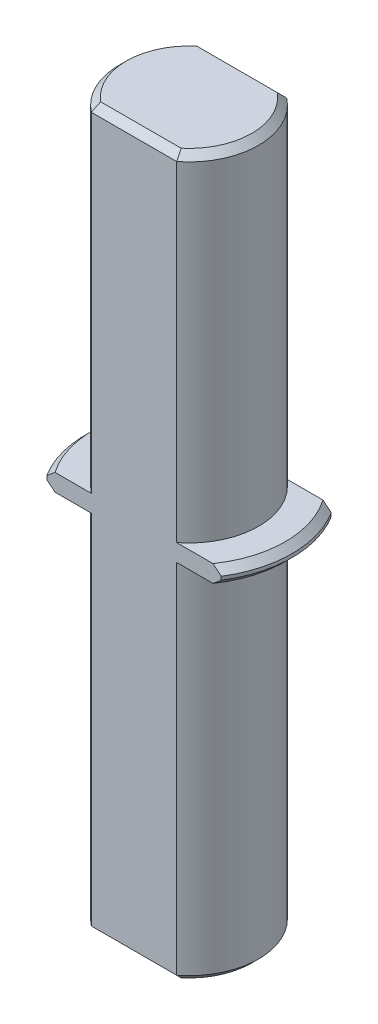
ISO-10303-21;
HEADER;
FILE_DESCRIPTION(('STEP AP214'),'2;1');
FILE_NAME('part.step','',(''),(''),'','','');
FILE_SCHEMA(('AUTOMOTIVE_DESIGN { 1 0 10303 214 1 1 1 1 }'));
ENDSEC;
DATA;
#1=APPLICATION_CONTEXT('core data for automotive mechanical design processes');
#2=APPLICATION_PROTOCOL_DEFINITION('international standard','automotive_design',2000,#1);
#3=PRODUCT_CONTEXT('',#1,'mechanical');
#4=PRODUCT('Part','Part','',(#3));
#5=PRODUCT_RELATED_PRODUCT_CATEGORY('part','',(#4));
#6=PRODUCT_DEFINITION_FORMATION('','',#4);
#7=PRODUCT_DEFINITION_CONTEXT('part definition',#1,'design');
#8=PRODUCT_DEFINITION('design','',#6,#7);
#9=PRODUCT_DEFINITION_SHAPE('','',#8);
#10=(LENGTH_UNIT() NAMED_UNIT(*) SI_UNIT(.MILLI.,.METRE.));
#11=(NAMED_UNIT(*) PLANE_ANGLE_UNIT() SI_UNIT($,.RADIAN.));
#12=(NAMED_UNIT(*) SI_UNIT($,.STERADIAN.) SOLID_ANGLE_UNIT());
#13=UNCERTAINTY_MEASURE_WITH_UNIT(LENGTH_MEASURE(1.E-05),#10,'distance_accuracy_value','');
#14=(GEOMETRIC_REPRESENTATION_CONTEXT(3) GLOBAL_UNCERTAINTY_ASSIGNED_CONTEXT((#13)) GLOBAL_UNIT_ASSIGNED_CONTEXT((#10,
#11,#12)) REPRESENTATION_CONTEXT('',''));
#15=CARTESIAN_POINT('',(0.,0.,0.));
#16=DIRECTION('',(0.,0.,1.));
#17=DIRECTION('',(1.,0.,0.));
#18=AXIS2_PLACEMENT_3D('',#15,#16,#17);
#19=CARTESIAN_POINT('',(0.,41.8,0.));
#20=DIRECTION('',(0.,-1.,0.));
#21=DIRECTION('',(0.,0.,-1.));
#22=AXIS2_PLACEMENT_3D('',#19,#20,#21);
#23=CYLINDRICAL_SURFACE('',#22,4.05);
#24=CARTESIAN_POINT('',(0.,21.2,0.));
#25=DIRECTION('',(0.,1.,0.));
#26=DIRECTION('',(0.,0.,1.));
#27=AXIS2_PLACEMENT_3D('',#24,#25,#26);
#28=CIRCLE('',#27,4.05);
#29=CARTESIAN_POINT('',(-2.48243831746128,21.2,-3.2));
#30=VERTEX_POINT('',#29);
#31=CARTESIAN_POINT('',(-2.48243831746128,21.2,3.2));
#32=VERTEX_POINT('',#31);
#33=EDGE_CURVE('E347',#30,#32,#28,.T.);
#34=ORIENTED_EDGE('',*,*,#33,.F.);
#35=DIRECTION('',(0.,-1.,0.));
#36=VECTOR('',#35,1.);
#37=CARTESIAN_POINT('',(-2.48243831746128,41.8,-3.2));
#38=LINE('',#37,#36);
#39=CARTESIAN_POINT('',(-2.48243831746128,0.400000000000005,-3.2));
#40=VERTEX_POINT('',#39);
#41=EDGE_CURVE('E533',#30,#40,#38,.T.);
#42=ORIENTED_EDGE('',*,*,#41,.T.);
#43=CARTESIAN_POINT('',(0.,0.400000000000005,0.));
#44=DIRECTION('',(0.,1.,0.));
#45=DIRECTION('',(0.,0.,1.));
#46=AXIS2_PLACEMENT_3D('',#43,#44,#45);
#47=CIRCLE('',#46,4.05);
#48=CARTESIAN_POINT('',(-2.48243831746128,0.400000000000005,3.2));
#49=VERTEX_POINT('',#48);
#50=EDGE_CURVE('E247',#40,#49,#47,.T.);
#51=ORIENTED_EDGE('',*,*,#50,.T.);
#52=DIRECTION('',(0.,-1.,0.));
#53=VECTOR('',#52,1.);
#54=CARTESIAN_POINT('',(-2.48243831746128,41.8,3.2));
#55=LINE('',#54,#53);
#56=EDGE_CURVE('E235',#32,#49,#55,.T.);
#57=ORIENTED_EDGE('',*,*,#56,.F.);
#58=EDGE_LOOP('',(#34,#42,#51,#57));
#59=FACE_BOUND('',#58,.T.);
#60=ADVANCED_FACE('F67',(#59),#23,.T.);
#61=CARTESIAN_POINT('',(0.,41.8,0.));
#62=DIRECTION('',(0.,-1.,0.));
#63=DIRECTION('',(0.,0.,-1.));
#64=AXIS2_PLACEMENT_3D('',#61,#62,#63);
#65=CYLINDRICAL_SURFACE('',#64,4.05);
#66=CARTESIAN_POINT('',(0.,21.2,0.));
#67=DIRECTION('',(0.,1.,0.));
#68=DIRECTION('',(0.,0.,1.));
#69=AXIS2_PLACEMENT_3D('',#66,#67,#68);
#70=CIRCLE('',#69,4.05);
#71=CARTESIAN_POINT('',(2.48243831746128,21.2,3.2));
#72=VERTEX_POINT('',#71);
#73=CARTESIAN_POINT('',(2.48243831746128,21.2,-3.2));
#74=VERTEX_POINT('',#73);
#75=EDGE_CURVE('E218',#72,#74,#70,.T.);
#76=ORIENTED_EDGE('',*,*,#75,.F.);
#77=DIRECTION('',(0.,-1.,0.));
#78=VECTOR('',#77,1.);
#79=CARTESIAN_POINT('',(2.48243831746128,41.8,3.2));
#80=LINE('',#79,#78);
#81=CARTESIAN_POINT('',(2.48243831746128,0.400000000000005,3.2));
#82=VERTEX_POINT('',#81);
#83=EDGE_CURVE('E236',#72,#82,#80,.T.);
#84=ORIENTED_EDGE('',*,*,#83,.T.);
#85=CARTESIAN_POINT('',(0.,0.400000000000005,0.));
#86=DIRECTION('',(0.,1.,0.));
#87=DIRECTION('',(0.,0.,1.));
#88=AXIS2_PLACEMENT_3D('',#85,#86,#87);
#89=CIRCLE('',#88,4.05);
#90=CARTESIAN_POINT('',(2.48243831746128,0.400000000000005,-3.2));
#91=VERTEX_POINT('',#90);
#92=EDGE_CURVE('E266',#82,#91,#89,.T.);
#93=ORIENTED_EDGE('',*,*,#92,.T.);
#94=DIRECTION('',(0.,-1.,0.));
#95=VECTOR('',#94,1.);
#96=CARTESIAN_POINT('',(2.48243831746128,41.8,-3.2));
#97=LINE('',#96,#95);
#98=EDGE_CURVE('E333',#74,#91,#97,.T.);
#99=ORIENTED_EDGE('',*,*,#98,.F.);
#100=EDGE_LOOP('',(#76,#84,#93,#99));
#101=FACE_BOUND('',#100,.T.);
#102=ADVANCED_FACE('F468',(#101),#65,.T.);
#103=CARTESIAN_POINT('',(0.,41.8,-3.2));
#104=DIRECTION('',(0.,0.,-1.));
#105=DIRECTION('',(-1.,0.,0.));
#106=AXIS2_PLACEMENT_3D('',#103,#104,#105);
#107=PLANE('',#106);
#108=DIRECTION('',(-1.,0.,0.));
#109=VECTOR('',#108,1.);
#110=CARTESIAN_POINT('',(-5.07543101617981,21.2,-3.2));
#111=LINE('',#110,#109);
#112=CARTESIAN_POINT('',(-4.59565011723042,21.2,-3.2));
#113=VERTEX_POINT('',#112);
#114=EDGE_CURVE('E491',#30,#113,#111,.T.);
#115=ORIENTED_EDGE('',*,*,#114,.T.);
#116=CARTESIAN_POINT('',(-4.59565011723042,21.2,-3.2));
#117=CARTESIAN_POINT('',(-4.67610965669546,21.2660717484227,-3.2));
#118=CARTESIAN_POINT('',(-4.75632118697368,21.3324409720207,-3.2));
#119=CARTESIAN_POINT('',(-4.9162481528166,21.465774305922,-3.2));
#120=CARTESIAN_POINT('',(-4.99596358885484,21.5327384156573,-3.2));
#121=CARTESIAN_POINT('',(-5.07543101617981,21.6,-3.2));
#122=B_SPLINE_CURVE_WITH_KNOTS('',3,(#116,#117,#118,#119,#120,#121),.UNSPECIFIED.,.F.,.F.,(4,2,
4),(0.,0.312328146146432,0.624655994118121),.UNSPECIFIED.);
#123=CARTESIAN_POINT('',(-5.07543101617981,21.6,-3.2));
#124=VERTEX_POINT('',#123);
#125=EDGE_CURVE('E455',#113,#124,#122,.T.);
#126=ORIENTED_EDGE('',*,*,#125,.T.);
#127=DIRECTION('',(0.,1.,0.));
#128=VECTOR('',#127,1.);
#129=CARTESIAN_POINT('',(-5.07543101617981,21.2,-3.2));
#130=LINE('',#129,#128);
#131=CARTESIAN_POINT('',(-5.07543101617981,21.8,-3.2));
#132=VERTEX_POINT('',#131);
#133=EDGE_CURVE('E522',#124,#132,#130,.T.);
#134=ORIENTED_EDGE('',*,*,#133,.T.);
#135=CARTESIAN_POINT('',(-5.07543101617981,21.8,-3.2));
#136=CARTESIAN_POINT('',(-4.99596358885484,21.8672615843427,-3.2));
#137=CARTESIAN_POINT('',(-4.9162481528166,21.9342256940779,-3.2));
#138=CARTESIAN_POINT('',(-4.75632118697368,22.0675590279793,-3.2));
#139=CARTESIAN_POINT('',(-4.67610965669545,22.1339282515773,-3.2));
#140=CARTESIAN_POINT('',(-4.59565011723042,22.2,-3.2));
#141=B_SPLINE_CURVE_WITH_KNOTS('',3,(#135,#136,#137,#138,#139,#140),.UNSPECIFIED.,.F.,.F.,(4,2,
4),(0.,0.312327847971689,0.624655994118121),.UNSPECIFIED.);
#142=CARTESIAN_POINT('',(-4.59565011723042,22.2,-3.2));
#143=VERTEX_POINT('',#142);
#144=EDGE_CURVE('E84',#132,#143,#141,.T.);
#145=ORIENTED_EDGE('',*,*,#144,.T.);
#146=DIRECTION('',(-1.,0.,0.));
#147=VECTOR('',#146,1.);
#148=CARTESIAN_POINT('',(-5.07543101617981,22.2,-3.2));
#149=LINE('',#148,#147);
#150=CARTESIAN_POINT('',(-2.48243831746128,22.2,-3.2));
#151=VERTEX_POINT('',#150);
#152=EDGE_CURVE('E572',#151,#143,#149,.T.);
#153=ORIENTED_EDGE('',*,*,#152,.F.);
#154=CARTESIAN_POINT('',(-2.48243831746128,41.4,-3.2));
#155=VERTEX_POINT('',#154);
#156=EDGE_CURVE('E248',#155,#151,#38,.T.);
#157=ORIENTED_EDGE('',*,*,#156,.F.);
#158=DIRECTION('',(1.,0.,0.));
#159=VECTOR('',#158,1.);
#160=CARTESIAN_POINT('',(0.,41.4,-3.2));
#161=LINE('',#160,#159);
#162=CARTESIAN_POINT('',(2.48243831746128,41.4,-3.2));
#163=VERTEX_POINT('',#162);
#164=EDGE_CURVE('E269',#155,#163,#161,.T.);
#165=ORIENTED_EDGE('',*,*,#164,.T.);
#166=CARTESIAN_POINT('',(2.48243831746128,22.2,-3.2));
#167=VERTEX_POINT('',#166);
#168=EDGE_CURVE('E240',#163,#167,#97,.T.);
#169=ORIENTED_EDGE('',*,*,#168,.T.);
#170=CARTESIAN_POINT('',(4.59565011723042,22.2,-3.2));
#171=VERTEX_POINT('',#170);
#172=EDGE_CURVE('E213',#171,#167,#149,.T.);
#173=ORIENTED_EDGE('',*,*,#172,.F.);
#174=CARTESIAN_POINT('',(4.59565011723042,22.2,-3.2));
#175=CARTESIAN_POINT('',(4.67610965669545,22.1339282515773,-3.2));
#176=CARTESIAN_POINT('',(4.75632118697368,22.0675590279793,-3.2));
#177=CARTESIAN_POINT('',(4.9162481528166,21.9342256940779,-3.20000000000001));
#178=CARTESIAN_POINT('',(4.99596358885484,21.8672615843427,-3.20000000000001));
#179=CARTESIAN_POINT('',(5.07543101617981,21.8,-3.2));
#180=B_SPLINE_CURVE_WITH_KNOTS('',3,(#174,#175,#176,#177,#178,#179),.UNSPECIFIED.,.F.,.F.,(4,2,
4),(0.,0.312328146146434,0.624655994118124),.UNSPECIFIED.);
#181=CARTESIAN_POINT('',(5.07543101617981,21.8,-3.2));
#182=VERTEX_POINT('',#181);
#183=EDGE_CURVE('E471',#171,#182,#180,.T.);
#184=ORIENTED_EDGE('',*,*,#183,.T.);
#185=DIRECTION('',(0.,1.,0.));
#186=VECTOR('',#185,1.);
#187=CARTESIAN_POINT('',(5.07543101617981,21.2,-3.2));
#188=LINE('',#187,#186);
#189=CARTESIAN_POINT('',(5.07543101617981,21.6,-3.2));
#190=VERTEX_POINT('',#189);
#191=EDGE_CURVE('E519',#190,#182,#188,.T.);
#192=ORIENTED_EDGE('',*,*,#191,.F.);
#193=CARTESIAN_POINT('',(5.07543101617981,21.6,-3.2));
#194=CARTESIAN_POINT('',(4.99596358885484,21.5327384156573,-3.2));
#195=CARTESIAN_POINT('',(4.9162481528166,21.465774305922,-3.2));
#196=CARTESIAN_POINT('',(4.75632118697368,21.3324409720207,-3.20000000000001));
#197=CARTESIAN_POINT('',(4.67610965669546,21.2660717484227,-3.20000000000001));
#198=CARTESIAN_POINT('',(4.59565011723042,21.2,-3.2));
#199=B_SPLINE_CURVE_WITH_KNOTS('',3,(#193,#194,#195,#196,#197,#198),.UNSPECIFIED.,.F.,.F.,(4,2,
4),(0.,0.312327847971687,0.624655994118117),.UNSPECIFIED.);
#200=CARTESIAN_POINT('',(4.59565011723042,21.2,-3.2));
#201=VERTEX_POINT('',#200);
#202=EDGE_CURVE('E91',#190,#201,#199,.T.);
#203=ORIENTED_EDGE('',*,*,#202,.T.);
#204=EDGE_CURVE('E511',#201,#74,#111,.T.);
#205=ORIENTED_EDGE('',*,*,#204,.T.);
#206=ORIENTED_EDGE('',*,*,#98,.T.);
#207=DIRECTION('',(-1.,0.,0.));
#208=VECTOR('',#207,1.);
#209=CARTESIAN_POINT('',(-2.48243831746128,0.400000000000005,-3.2));
#210=LINE('',#209,#208);
#211=EDGE_CURVE('E271',#91,#40,#210,.T.);
#212=ORIENTED_EDGE('',*,*,#211,.T.);
#213=ORIENTED_EDGE('',*,*,#41,.F.);
#214=EDGE_LOOP('',(#115,#126,#134,#145,#153,#157,#165,#169,#173,#184,#192,#203,#205,#206,#212,#213));
#215=FACE_BOUND('',#214,.T.);
#216=ADVANCED_FACE('F415',(#215),#107,.T.);
#217=CARTESIAN_POINT('',(0.,0.,0.));
#218=DIRECTION('',(0.,1.,0.));
#219=DIRECTION('',(0.,0.,1.));
#220=AXIS2_PLACEMENT_3D('',#217,#218,#219);
#221=PLANE('',#220);
#222=DIRECTION('',(-1.,0.,0.));
#223=VECTOR('',#222,1.);
#224=CARTESIAN_POINT('',(0.,0.,2.8));
#225=LINE('',#224,#223);
#226=CARTESIAN_POINT('',(2.34147389479392,0.,2.79999999999975));
#227=VERTEX_POINT('',#226);
#228=CARTESIAN_POINT('',(-2.34147389479392,0.,2.8));
#229=VERTEX_POINT('',#228);
#230=EDGE_CURVE('E255',#227,#229,#225,.T.);
#231=ORIENTED_EDGE('',*,*,#230,.T.);
#232=CARTESIAN_POINT('',(0.,0.,0.));
#233=DIRECTION('',(0.,1.,0.));
#234=DIRECTION('',(0.,0.,1.));
#235=AXIS2_PLACEMENT_3D('',#232,#233,#234);
#236=CIRCLE('',#235,3.65);
#237=CARTESIAN_POINT('',(-2.34147389479392,0.,-2.8));
#238=VERTEX_POINT('',#237);
#239=EDGE_CURVE('E257',#229,#238,#236,.F.);
#240=ORIENTED_EDGE('',*,*,#239,.T.);
#241=DIRECTION('',(1.,0.,0.));
#242=VECTOR('',#241,1.);
#243=CARTESIAN_POINT('',(2.48243831746128,0.,-2.8));
#244=LINE('',#243,#242);
#245=CARTESIAN_POINT('',(2.34147389479391,0.,-2.8));
#246=VERTEX_POINT('',#245);
#247=EDGE_CURVE('E251',#238,#246,#244,.T.);
#248=ORIENTED_EDGE('',*,*,#247,.T.);
#249=CARTESIAN_POINT('',(0.,0.,0.));
#250=DIRECTION('',(0.,1.,0.));
#251=DIRECTION('',(0.,0.,1.));
#252=AXIS2_PLACEMENT_3D('',#249,#250,#251);
#253=CIRCLE('',#252,3.65);
#254=EDGE_CURVE('E253',#246,#227,#253,.F.);
#255=ORIENTED_EDGE('',*,*,#254,.T.);
#256=EDGE_LOOP('',(#231,#240,#248,#255));
#257=FACE_BOUND('',#256,.T.);
#258=ADVANCED_FACE('F414',(#257),#221,.F.);
#259=CARTESIAN_POINT('',(0.,41.8,3.2));
#260=DIRECTION('',(0.,0.,-1.));
#261=DIRECTION('',(-1.,0.,0.));
#262=AXIS2_PLACEMENT_3D('',#259,#260,#261);
#263=PLANE('',#262);
#264=DIRECTION('',(0.,1.,0.));
#265=VECTOR('',#264,1.);
#266=CARTESIAN_POINT('',(-5.07543101617981,21.2,3.2));
#267=LINE('',#266,#265);
#268=CARTESIAN_POINT('',(-5.07543101617981,21.6,3.2));
#269=VERTEX_POINT('',#268);
#270=CARTESIAN_POINT('',(-5.07543101617981,21.8,3.2));
#271=VERTEX_POINT('',#270);
#272=EDGE_CURVE('E485',#269,#271,#267,.T.);
#273=ORIENTED_EDGE('',*,*,#272,.F.);
#274=CARTESIAN_POINT('',(-5.07543101617981,21.6,3.2));
#275=CARTESIAN_POINT('',(-4.99596358885484,21.5327384156573,3.2));
#276=CARTESIAN_POINT('',(-4.9162481528166,21.465774305922,3.2));
#277=CARTESIAN_POINT('',(-4.75632118697368,21.3324409720207,3.2));
#278=CARTESIAN_POINT('',(-4.67610965669545,21.2660717484227,3.2));
#279=CARTESIAN_POINT('',(-4.59565011723042,21.2,3.2));
#280=B_SPLINE_CURVE_WITH_KNOTS('',3,(#274,#275,#276,#277,#278,#279),.UNSPECIFIED.,.F.,.F.,(4,2,
4),(0.,0.312327847971686,0.624655994118119),.UNSPECIFIED.);
#281=CARTESIAN_POINT('',(-4.59565011723042,21.2,3.2));
#282=VERTEX_POINT('',#281);
#283=EDGE_CURVE('E428',#269,#282,#280,.T.);
#284=ORIENTED_EDGE('',*,*,#283,.T.);
#285=DIRECTION('',(1.,0.,0.));
#286=VECTOR('',#285,1.);
#287=CARTESIAN_POINT('',(-5.07543101617981,21.2,3.2));
#288=LINE('',#287,#286);
#289=EDGE_CURVE('E482',#282,#32,#288,.T.);
#290=ORIENTED_EDGE('',*,*,#289,.T.);
#291=ORIENTED_EDGE('',*,*,#56,.T.);
#292=DIRECTION('',(1.,0.,0.));
#293=VECTOR('',#292,1.);
#294=CARTESIAN_POINT('',(0.,0.400000000000005,3.2));
#295=LINE('',#294,#293);
#296=EDGE_CURVE('E262',#49,#82,#295,.T.);
#297=ORIENTED_EDGE('',*,*,#296,.T.);
#298=ORIENTED_EDGE('',*,*,#83,.F.);
#299=CARTESIAN_POINT('',(4.59565011723042,21.2,3.2));
#300=VERTEX_POINT('',#299);
#301=EDGE_CURVE('E492',#72,#300,#288,.T.);
#302=ORIENTED_EDGE('',*,*,#301,.T.);
#303=CARTESIAN_POINT('',(4.59565011723042,21.2,3.2));
#304=CARTESIAN_POINT('',(4.67610965669546,21.2660717484227,3.2));
#305=CARTESIAN_POINT('',(4.75632118697368,21.3324409720207,3.2));
#306=CARTESIAN_POINT('',(4.9162481528166,21.465774305922,3.2));
#307=CARTESIAN_POINT('',(4.99596358885484,21.5327384156573,3.2));
#308=CARTESIAN_POINT('',(5.07543101617981,21.6,3.2));
#309=B_SPLINE_CURVE_WITH_KNOTS('',3,(#303,#304,#305,#306,#307,#308),.UNSPECIFIED.,.F.,.F.,(4,2,
4),(0.,0.312328146146432,0.624655994118119),.UNSPECIFIED.);
#310=CARTESIAN_POINT('',(5.07543101617981,21.6,3.2));
#311=VERTEX_POINT('',#310);
#312=EDGE_CURVE('E403',#300,#311,#309,.T.);
#313=ORIENTED_EDGE('',*,*,#312,.T.);
#314=DIRECTION('',(0.,1.,0.));
#315=VECTOR('',#314,1.);
#316=CARTESIAN_POINT('',(5.07543101617981,21.2,3.2));
#317=LINE('',#316,#315);
#318=CARTESIAN_POINT('',(5.07543101617981,21.8,3.2));
#319=VERTEX_POINT('',#318);
#320=EDGE_CURVE('E521',#311,#319,#317,.T.);
#321=ORIENTED_EDGE('',*,*,#320,.T.);
#322=CARTESIAN_POINT('',(5.07543101617981,21.8,3.2));
#323=CARTESIAN_POINT('',(4.99596358885484,21.8672615843427,3.2));
#324=CARTESIAN_POINT('',(4.9162481528166,21.9342256940779,3.2));
#325=CARTESIAN_POINT('',(4.75632118697368,22.0675590279793,3.2));
#326=CARTESIAN_POINT('',(4.67610965669545,22.1339282515773,3.2));
#327=CARTESIAN_POINT('',(4.59565011723042,22.2,3.2));
#328=B_SPLINE_CURVE_WITH_KNOTS('',3,(#322,#323,#324,#325,#326,#327),.UNSPECIFIED.,.F.,.F.,(4,2,
4),(0.,0.312327847971688,0.624655994118123),.UNSPECIFIED.);
#329=CARTESIAN_POINT('',(4.59565011723042,22.2,3.2));
#330=VERTEX_POINT('',#329);
#331=EDGE_CURVE('E229',#319,#330,#328,.T.);
#332=ORIENTED_EDGE('',*,*,#331,.T.);
#333=DIRECTION('',(1.,0.,0.));
#334=VECTOR('',#333,1.);
#335=CARTESIAN_POINT('',(-5.07543101617981,22.2,3.2));
#336=LINE('',#335,#334);
#337=CARTESIAN_POINT('',(2.48243831746128,22.2,3.2));
#338=VERTEX_POINT('',#337);
#339=EDGE_CURVE('E210',#338,#330,#336,.T.);
#340=ORIENTED_EDGE('',*,*,#339,.F.);
#341=CARTESIAN_POINT('',(2.48243831746128,41.4,3.2));
#342=VERTEX_POINT('',#341);
#343=EDGE_CURVE('E225',#342,#338,#80,.T.);
#344=ORIENTED_EDGE('',*,*,#343,.F.);
#345=DIRECTION('',(-1.,0.,0.));
#346=VECTOR('',#345,1.);
#347=CARTESIAN_POINT('',(-2.48243831746128,41.4,3.2));
#348=LINE('',#347,#346);
#349=CARTESIAN_POINT('',(-2.48243831746128,41.4,3.2));
#350=VERTEX_POINT('',#349);
#351=EDGE_CURVE('E260',#342,#350,#348,.T.);
#352=ORIENTED_EDGE('',*,*,#351,.T.);
#353=CARTESIAN_POINT('',(-2.48243831746128,22.2,3.2));
#354=VERTEX_POINT('',#353);
#355=EDGE_CURVE('E238',#350,#354,#55,.T.);
#356=ORIENTED_EDGE('',*,*,#355,.T.);
#357=CARTESIAN_POINT('',(-4.59565011723042,22.2,3.2));
#358=VERTEX_POINT('',#357);
#359=EDGE_CURVE('E230',#358,#354,#336,.T.);
#360=ORIENTED_EDGE('',*,*,#359,.F.);
#361=CARTESIAN_POINT('',(-4.59565011723042,22.2,3.2));
#362=CARTESIAN_POINT('',(-4.67610965669545,22.1339282515773,3.2));
#363=CARTESIAN_POINT('',(-4.75632118697368,22.0675590279793,3.2));
#364=CARTESIAN_POINT('',(-4.9162481528166,21.9342256940779,3.2));
#365=CARTESIAN_POINT('',(-4.99596358885484,21.8672615843427,3.2));
#366=CARTESIAN_POINT('',(-5.07543101617981,21.8,3.2));
#367=B_SPLINE_CURVE_WITH_KNOTS('',3,(#361,#362,#363,#364,#365,#366),.UNSPECIFIED.,.F.,.F.,(4,2,
4),(0.,0.312328146146434,0.624655994118122),.UNSPECIFIED.);
#368=EDGE_CURVE('E422',#358,#271,#367,.T.);
#369=ORIENTED_EDGE('',*,*,#368,.T.);
#370=EDGE_LOOP('',(#273,#284,#290,#291,#297,#298,#302,#313,#321,#332,#340,#344,#352,#356,#360,#369));
#371=FACE_BOUND('',#370,.T.);
#372=ADVANCED_FACE('F224',(#371),#263,.F.);
#373=ORIENTED_EDGE('',*,*,#156,.T.);
#374=CARTESIAN_POINT('',(0.,22.2,0.));
#375=DIRECTION('',(0.,1.,0.));
#376=DIRECTION('',(0.,0.,1.));
#377=AXIS2_PLACEMENT_3D('',#374,#375,#376);
#378=CIRCLE('',#377,4.05);
#379=EDGE_CURVE('E524',#151,#354,#378,.T.);
#380=ORIENTED_EDGE('',*,*,#379,.T.);
#381=ORIENTED_EDGE('',*,*,#355,.F.);
#382=CARTESIAN_POINT('',(0.,41.4,0.));
#383=DIRECTION('',(0.,1.,0.));
#384=DIRECTION('',(0.,0.,1.));
#385=AXIS2_PLACEMENT_3D('',#382,#383,#384);
#386=CIRCLE('',#385,4.05);
#387=EDGE_CURVE('E244',#350,#155,#386,.F.);
#388=ORIENTED_EDGE('',*,*,#387,.T.);
#389=EDGE_LOOP('',(#373,#380,#381,#388));
#390=FACE_BOUND('',#389,.T.);
#391=ADVANCED_FACE('F413',(#390),#23,.T.);
#392=CARTESIAN_POINT('',(0.,41.8,0.));
#393=DIRECTION('',(0.,1.,0.));
#394=DIRECTION('',(0.,0.,1.));
#395=AXIS2_PLACEMENT_3D('',#392,#393,#394);
#396=PLANE('',#395);
#397=DIRECTION('',(-1.,0.,0.));
#398=VECTOR('',#397,1.);
#399=CARTESIAN_POINT('',(0.,41.8,-2.8));
#400=LINE('',#399,#398);
#401=CARTESIAN_POINT('',(2.34147389479391,41.8,-2.79999999999975));
#402=VERTEX_POINT('',#401);
#403=CARTESIAN_POINT('',(-2.34147389479392,41.8,-2.8));
#404=VERTEX_POINT('',#403);
#405=EDGE_CURVE('E278',#402,#404,#400,.T.);
#406=ORIENTED_EDGE('',*,*,#405,.T.);
#407=CARTESIAN_POINT('',(0.,41.8,0.));
#408=DIRECTION('',(0.,1.,0.));
#409=DIRECTION('',(0.,0.,1.));
#410=AXIS2_PLACEMENT_3D('',#407,#408,#409);
#411=CIRCLE('',#410,3.65);
#412=CARTESIAN_POINT('',(-2.34147389479392,41.8,2.8));
#413=VERTEX_POINT('',#412);
#414=EDGE_CURVE('E219',#404,#413,#411,.T.);
#415=ORIENTED_EDGE('',*,*,#414,.T.);
#416=DIRECTION('',(1.,0.,0.));
#417=VECTOR('',#416,1.);
#418=CARTESIAN_POINT('',(2.48243831746128,41.8,2.8));
#419=LINE('',#418,#417);
#420=CARTESIAN_POINT('',(2.34147389479392,41.8,2.8));
#421=VERTEX_POINT('',#420);
#422=EDGE_CURVE('E274',#413,#421,#419,.T.);
#423=ORIENTED_EDGE('',*,*,#422,.T.);
#424=CARTESIAN_POINT('',(0.,41.8,0.));
#425=DIRECTION('',(0.,1.,0.));
#426=DIRECTION('',(0.,0.,1.));
#427=AXIS2_PLACEMENT_3D('',#424,#425,#426);
#428=CIRCLE('',#427,3.65);
#429=EDGE_CURVE('E276',#421,#402,#428,.T.);
#430=ORIENTED_EDGE('',*,*,#429,.T.);
#431=EDGE_LOOP('',(#406,#415,#423,#430));
#432=FACE_BOUND('',#431,.T.);
#433=ADVANCED_FACE('F566',(#432),#396,.T.);
#434=ORIENTED_EDGE('',*,*,#343,.T.);
#435=CARTESIAN_POINT('',(0.,22.2,0.));
#436=DIRECTION('',(0.,1.,0.));
#437=DIRECTION('',(0.,0.,1.));
#438=AXIS2_PLACEMENT_3D('',#435,#436,#437);
#439=CIRCLE('',#438,4.05);
#440=EDGE_CURVE('E207',#338,#167,#439,.T.);
#441=ORIENTED_EDGE('',*,*,#440,.T.);
#442=ORIENTED_EDGE('',*,*,#168,.F.);
#443=CARTESIAN_POINT('',(0.,41.4,0.));
#444=DIRECTION('',(0.,1.,0.));
#445=DIRECTION('',(0.,0.,1.));
#446=AXIS2_PLACEMENT_3D('',#443,#444,#445);
#447=CIRCLE('',#446,4.05);
#448=EDGE_CURVE('E234',#163,#342,#447,.F.);
#449=ORIENTED_EDGE('',*,*,#448,.T.);
#450=EDGE_LOOP('',(#434,#441,#442,#449));
#451=FACE_BOUND('',#450,.T.);
#452=ADVANCED_FACE('F232',(#451),#65,.T.);
#453=CARTESIAN_POINT('',(0.,0.400000000000005,0.));
#454=DIRECTION('',(0.,1.,0.));
#455=DIRECTION('',(0.,0.,1.));
#456=AXIS2_PLACEMENT_3D('',#453,#454,#455);
#457=CONICAL_SURFACE('',#456,4.05,0.785398163397444);
#458=CARTESIAN_POINT('',(2.48243831746128,0.400000000000005,3.2));
#459=CARTESIAN_POINT('',(2.45959054305929,0.333219495624438,3.13321949562443));
#460=CARTESIAN_POINT('',(2.43641962800462,0.266495930417794,3.06649593041779));
#461=CARTESIAN_POINT('',(2.38943148790474,0.133162596945403,2.9331625969454));
#462=CARTESIAN_POINT('',(2.36561426207045,0.0665528288186963,2.86655282881869));
#463=CARTESIAN_POINT('',(2.3414738947944,0.,2.79999999999995));
#464=B_SPLINE_CURVE_WITH_KNOTS('',3,(#458,#459,#460,#461,#462,#463),.UNSPECIFIED.,.F.,.F.,(4,2,
4),(0.,0.291493801838339,0.582987959577496),.UNSPECIFIED.);
#465=EDGE_CURVE('E334',#227,#82,#464,.F.);
#466=ORIENTED_EDGE('',*,*,#465,.F.);
#467=ORIENTED_EDGE('',*,*,#254,.F.);
#468=CARTESIAN_POINT('',(2.48243831746128,0.400000000000005,-3.2));
#469=CARTESIAN_POINT('',(2.45959054305928,0.333219495624412,-3.13321949562441));
#470=CARTESIAN_POINT('',(2.4364196280046,0.266495930417743,-3.06649593041774));
#471=CARTESIAN_POINT('',(2.38943148790471,0.133162596945302,-2.9331625969453));
#472=CARTESIAN_POINT('',(2.3656142620704,0.06655282881857,-2.86655282881857));
#473=CARTESIAN_POINT('',(2.34147389479434,-1.98111827139523E-13,-2.7999999999998));
#474=B_SPLINE_CURVE_WITH_KNOTS('',3,(#468,#469,#470,#471,#472,#473),.UNSPECIFIED.,.F.,.F.,(4,2,
4),(0.,0.291493801838449,0.582987959577717),.UNSPECIFIED.);
#475=EDGE_CURVE('E326',#91,#246,#474,.T.);
#476=ORIENTED_EDGE('',*,*,#475,.F.);
#477=ORIENTED_EDGE('',*,*,#92,.F.);
#478=EDGE_LOOP('',(#466,#467,#476,#477));
#479=FACE_BOUND('',#478,.T.);
#480=ADVANCED_FACE('F320',(#479),#457,.T.);
#481=CARTESIAN_POINT('',(0.,0.,-2.8));
#482=DIRECTION('',(0.,-0.707106781186544,-0.707106781186551));
#483=DIRECTION('',(-1.,0.,0.));
#484=AXIS2_PLACEMENT_3D('',#481,#482,#483);
#485=PLANE('',#484);
#486=ORIENTED_EDGE('',*,*,#475,.T.);
#487=ORIENTED_EDGE('',*,*,#247,.F.);
#488=CARTESIAN_POINT('',(-2.34147389479392,0.,-2.79999999999975));
#489=CARTESIAN_POINT('',(-2.36561426207004,0.0665528288186941,-2.86655282881857));
#490=CARTESIAN_POINT('',(-2.38943148790448,0.133162596945359,-2.93316259694531));
#491=CARTESIAN_POINT('',(-2.43641962800483,0.266495930417679,-3.06649593041772));
#492=CARTESIAN_POINT('',(-2.45959054305981,0.333219495624293,-3.13321949562433));
#493=CARTESIAN_POINT('',(-2.4824383174622,0.399999999999838,-3.19999999999983));
#494=B_SPLINE_CURVE_WITH_KNOTS('',3,(#488,#489,#490,#491,#492,#493),.UNSPECIFIED.,.F.,.F.,(4,2,
4),(0.,0.291494157739267,0.582987959577711),.UNSPECIFIED.);
#495=EDGE_CURVE('E291',#40,#238,#494,.F.);
#496=ORIENTED_EDGE('',*,*,#495,.F.);
#497=ORIENTED_EDGE('',*,*,#211,.F.);
#498=EDGE_LOOP('',(#486,#487,#496,#497));
#499=FACE_BOUND('',#498,.T.);
#500=ADVANCED_FACE('F312',(#499),#485,.T.);
#501=CARTESIAN_POINT('',(0.,0.400000000000005,3.2));
#502=DIRECTION('',(0.,0.707106781186544,-0.707106781186551));
#503=DIRECTION('',(1.,0.,0.));
#504=AXIS2_PLACEMENT_3D('',#501,#502,#503);
#505=PLANE('',#504);
#506=ORIENTED_EDGE('',*,*,#465,.T.);
#507=ORIENTED_EDGE('',*,*,#296,.F.);
#508=CARTESIAN_POINT('',(-2.48243831746128,0.400000000000005,3.2));
#509=CARTESIAN_POINT('',(-2.45959054305928,0.333219495624412,3.13321949562441));
#510=CARTESIAN_POINT('',(-2.43641962800461,0.266495930417744,3.06649593041774));
#511=CARTESIAN_POINT('',(-2.38943148790471,0.133162596945302,2.9331625969453));
#512=CARTESIAN_POINT('',(-2.36561426207041,0.0665528288185701,2.86655282881857));
#513=CARTESIAN_POINT('',(-2.34147389479434,-1.98159594131561E-13,2.7999999999998));
#514=B_SPLINE_CURVE_WITH_KNOTS('',3,(#508,#509,#510,#511,#512,#513),.UNSPECIFIED.,.F.,.F.,(4,2,
4),(0.,0.291493801838449,0.582987959577717),.UNSPECIFIED.);
#515=EDGE_CURVE('E282',#229,#49,#514,.F.);
#516=ORIENTED_EDGE('',*,*,#515,.F.);
#517=ORIENTED_EDGE('',*,*,#230,.F.);
#518=EDGE_LOOP('',(#506,#507,#516,#517));
#519=FACE_BOUND('',#518,.T.);
#520=ADVANCED_FACE('F300',(#519),#505,.F.);
#521=CARTESIAN_POINT('',(0.,0.400000000000005,0.));
#522=DIRECTION('',(0.,1.,0.));
#523=DIRECTION('',(0.,0.,1.));
#524=AXIS2_PLACEMENT_3D('',#521,#522,#523);
#525=CONICAL_SURFACE('',#524,4.05,0.785398163397444);
#526=ORIENTED_EDGE('',*,*,#495,.T.);
#527=ORIENTED_EDGE('',*,*,#239,.F.);
#528=ORIENTED_EDGE('',*,*,#515,.T.);
#529=ORIENTED_EDGE('',*,*,#50,.F.);
#530=EDGE_LOOP('',(#526,#527,#528,#529));
#531=FACE_BOUND('',#530,.T.);
#532=ADVANCED_FACE('F304',(#531),#525,.T.);
#533=CARTESIAN_POINT('',(0.,41.8,0.));
#534=DIRECTION('',(0.,-1.,0.));
#535=DIRECTION('',(0.,0.,-1.));
#536=AXIS2_PLACEMENT_3D('',#533,#534,#535);
#537=CONICAL_SURFACE('',#536,3.65,0.785398163397444);
#538=CARTESIAN_POINT('',(2.48243831746128,41.4,3.2));
#539=CARTESIAN_POINT('',(2.45959054305928,41.4667805043756,3.13321949562441));
#540=CARTESIAN_POINT('',(2.4364196280046,41.5335040695823,3.06649593041774));
#541=CARTESIAN_POINT('',(2.38943148790471,41.6668374030547,2.9331625969453));
#542=CARTESIAN_POINT('',(2.36561426207041,41.7334471711814,2.86655282881857));
#543=CARTESIAN_POINT('',(2.34147389479434,41.8000000000002,2.7999999999998));
#544=B_SPLINE_CURVE_WITH_KNOTS('',3,(#538,#539,#540,#541,#542,#543),.UNSPECIFIED.,.F.,.F.,(4,2,
4),(0.,0.291493801838451,0.582987959577719),.UNSPECIFIED.);
#545=EDGE_CURVE('E384',#342,#421,#544,.T.);
#546=ORIENTED_EDGE('',*,*,#545,.F.);
#547=ORIENTED_EDGE('',*,*,#448,.F.);
#548=CARTESIAN_POINT('',(2.48243831746128,41.4,-3.2));
#549=CARTESIAN_POINT('',(2.45959054305929,41.4667805043756,-3.13321949562443));
#550=CARTESIAN_POINT('',(2.43641962800462,41.5335040695822,-3.06649593041779));
#551=CARTESIAN_POINT('',(2.38943148790474,41.6668374030546,-2.9331625969454));
#552=CARTESIAN_POINT('',(2.36561426207045,41.7334471711813,-2.86655282881869));
#553=CARTESIAN_POINT('',(2.3414738947944,41.8,-2.79999999999995));
#554=B_SPLINE_CURVE_WITH_KNOTS('',3,(#548,#549,#550,#551,#552,#553),.UNSPECIFIED.,.F.,.F.,(4,2,
4),(0.,0.29149380183834,0.582987959577498),.UNSPECIFIED.);
#555=EDGE_CURVE('E292',#402,#163,#554,.F.);
#556=ORIENTED_EDGE('',*,*,#555,.F.);
#557=ORIENTED_EDGE('',*,*,#429,.F.);
#558=EDGE_LOOP('',(#546,#547,#556,#557));
#559=FACE_BOUND('',#558,.T.);
#560=ADVANCED_FACE('F310',(#559),#537,.T.);
#561=CARTESIAN_POINT('',(0.,41.4,-3.2));
#562=DIRECTION('',(0.,-0.707106781186544,0.707106781186551));
#563=DIRECTION('',(1.,0.,0.));
#564=AXIS2_PLACEMENT_3D('',#561,#562,#563);
#565=PLANE('',#564);
#566=ORIENTED_EDGE('',*,*,#555,.T.);
#567=ORIENTED_EDGE('',*,*,#164,.F.);
#568=CARTESIAN_POINT('',(-2.48243831746128,41.4,-3.2));
#569=CARTESIAN_POINT('',(-2.45959054305928,41.4667805043756,-3.13321949562441));
#570=CARTESIAN_POINT('',(-2.43641962800461,41.5335040695823,-3.06649593041774));
#571=CARTESIAN_POINT('',(-2.38943148790471,41.6668374030547,-2.9331625969453));
#572=CARTESIAN_POINT('',(-2.36561426207041,41.7334471711814,-2.86655282881857));
#573=CARTESIAN_POINT('',(-2.34147389479435,41.8000000000002,-2.7999999999998));
#574=B_SPLINE_CURVE_WITH_KNOTS('',3,(#568,#569,#570,#571,#572,#573),.UNSPECIFIED.,.F.,.F.,(4,2,
4),(0.,0.291493801838451,0.582987959577719),.UNSPECIFIED.);
#575=EDGE_CURVE('E346',#404,#155,#574,.F.);
#576=ORIENTED_EDGE('',*,*,#575,.F.);
#577=ORIENTED_EDGE('',*,*,#405,.F.);
#578=EDGE_LOOP('',(#566,#567,#576,#577));
#579=FACE_BOUND('',#578,.T.);
#580=ADVANCED_FACE('F366',(#579),#565,.F.);
#581=CARTESIAN_POINT('',(0.,41.8,2.8));
#582=DIRECTION('',(0.,0.707106781186544,0.707106781186551));
#583=DIRECTION('',(-1.,0.,0.));
#584=AXIS2_PLACEMENT_3D('',#581,#582,#583);
#585=PLANE('',#584);
#586=ORIENTED_EDGE('',*,*,#545,.T.);
#587=ORIENTED_EDGE('',*,*,#422,.F.);
#588=CARTESIAN_POINT('',(-2.34147389479392,41.8,2.79999999999975));
#589=CARTESIAN_POINT('',(-2.36561426207004,41.7334471711813,2.86655282881857));
#590=CARTESIAN_POINT('',(-2.38943148790448,41.6668374030546,2.93316259694532));
#591=CARTESIAN_POINT('',(-2.43641962800483,41.5335040695823,3.06649593041772));
#592=CARTESIAN_POINT('',(-2.45959054305981,41.4667805043757,3.13321949562433));
#593=CARTESIAN_POINT('',(-2.48243831746219,41.4000000000002,3.19999999999983));
#594=B_SPLINE_CURVE_WITH_KNOTS('',3,(#588,#589,#590,#591,#592,#593),.UNSPECIFIED.,.F.,.F.,(4,2,
4),(0.,0.291494157739264,0.582987959577711),.UNSPECIFIED.);
#595=EDGE_CURVE('E339',#350,#413,#594,.F.);
#596=ORIENTED_EDGE('',*,*,#595,.F.);
#597=ORIENTED_EDGE('',*,*,#351,.F.);
#598=EDGE_LOOP('',(#586,#587,#596,#597));
#599=FACE_BOUND('',#598,.T.);
#600=ADVANCED_FACE('F355',(#599),#585,.T.);
#601=CARTESIAN_POINT('',(0.,41.8,0.));
#602=DIRECTION('',(0.,-1.,0.));
#603=DIRECTION('',(0.,0.,-1.));
#604=AXIS2_PLACEMENT_3D('',#601,#602,#603);
#605=CONICAL_SURFACE('',#604,3.65,0.785398163397444);
#606=ORIENTED_EDGE('',*,*,#575,.T.);
#607=ORIENTED_EDGE('',*,*,#387,.F.);
#608=ORIENTED_EDGE('',*,*,#595,.T.);
#609=ORIENTED_EDGE('',*,*,#414,.F.);
#610=EDGE_LOOP('',(#606,#607,#608,#609));
#611=FACE_BOUND('',#610,.T.);
#612=ADVANCED_FACE('F358',(#611),#605,.T.);
#613=CARTESIAN_POINT('',(0.,21.2,0.));
#614=DIRECTION('',(0.,1.,0.));
#615=DIRECTION('',(0.,0.,1.));
#616=AXIS2_PLACEMENT_3D('',#613,#614,#615);
#617=CYLINDRICAL_SURFACE('',#616,6.);
#618=ORIENTED_EDGE('',*,*,#320,.F.);
#619=CARTESIAN_POINT('',(0.,21.6,0.));
#620=DIRECTION('',(0.,1.,0.));
#621=DIRECTION('',(0.,0.,1.));
#622=AXIS2_PLACEMENT_3D('',#619,#620,#621);
#623=CIRCLE('',#622,6.);
#624=EDGE_CURVE('E502',#311,#190,#623,.T.);
#625=ORIENTED_EDGE('',*,*,#624,.T.);
#626=ORIENTED_EDGE('',*,*,#191,.T.);
#627=CARTESIAN_POINT('',(0.,21.8,0.));
#628=DIRECTION('',(0.,1.,0.));
#629=DIRECTION('',(0.,0.,1.));
#630=AXIS2_PLACEMENT_3D('',#627,#628,#629);
#631=CIRCLE('',#630,6.);
#632=EDGE_CURVE('E498',#182,#319,#631,.F.);
#633=ORIENTED_EDGE('',*,*,#632,.T.);
#634=EDGE_LOOP('',(#618,#625,#626,#633));
#635=FACE_BOUND('',#634,.T.);
#636=ADVANCED_FACE('F364',(#635),#617,.T.);
#637=CARTESIAN_POINT('',(0.,22.2,0.));
#638=DIRECTION('',(0.,1.,0.));
#639=DIRECTION('',(0.,0.,1.));
#640=AXIS2_PLACEMENT_3D('',#637,#638,#639);
#641=PLANE('',#640);
#642=ORIENTED_EDGE('',*,*,#339,.T.);
#643=CARTESIAN_POINT('',(0.,22.2,0.));
#644=DIRECTION('',(0.,1.,0.));
#645=DIRECTION('',(0.,0.,1.));
#646=AXIS2_PLACEMENT_3D('',#643,#644,#645);
#647=CIRCLE('',#646,5.6);
#648=EDGE_CURVE('E12',#330,#171,#647,.T.);
#649=ORIENTED_EDGE('',*,*,#648,.T.);
#650=ORIENTED_EDGE('',*,*,#172,.T.);
#651=ORIENTED_EDGE('',*,*,#440,.F.);
#652=EDGE_LOOP('',(#642,#649,#650,#651));
#653=FACE_BOUND('',#652,.T.);
#654=ADVANCED_FACE('F209',(#653),#641,.T.);
#655=CARTESIAN_POINT('',(0.,21.2,0.));
#656=DIRECTION('',(0.,1.,0.));
#657=DIRECTION('',(0.,0.,1.));
#658=AXIS2_PLACEMENT_3D('',#655,#656,#657);
#659=PLANE('',#658);
#660=ORIENTED_EDGE('',*,*,#204,.F.);
#661=CARTESIAN_POINT('',(0.,21.2,0.));
#662=DIRECTION('',(0.,1.,0.));
#663=DIRECTION('',(0.,0.,1.));
#664=AXIS2_PLACEMENT_3D('',#661,#662,#663);
#665=CIRCLE('',#664,5.6);
#666=EDGE_CURVE('E77',#201,#300,#665,.F.);
#667=ORIENTED_EDGE('',*,*,#666,.T.);
#668=ORIENTED_EDGE('',*,*,#301,.F.);
#669=ORIENTED_EDGE('',*,*,#75,.T.);
#670=EDGE_LOOP('',(#660,#667,#668,#669));
#671=FACE_BOUND('',#670,.T.);
#672=ADVANCED_FACE('F509',(#671),#659,.F.);
#673=ORIENTED_EDGE('',*,*,#289,.F.);
#674=CARTESIAN_POINT('',(0.,21.2,0.));
#675=DIRECTION('',(0.,1.,0.));
#676=DIRECTION('',(0.,0.,1.));
#677=AXIS2_PLACEMENT_3D('',#674,#675,#676);
#678=CIRCLE('',#677,5.6);
#679=EDGE_CURVE('E477',#282,#113,#678,.F.);
#680=ORIENTED_EDGE('',*,*,#679,.T.);
#681=ORIENTED_EDGE('',*,*,#114,.F.);
#682=ORIENTED_EDGE('',*,*,#33,.T.);
#683=EDGE_LOOP('',(#673,#680,#681,#682));
#684=FACE_BOUND('',#683,.T.);
#685=ADVANCED_FACE('F488',(#684),#659,.F.);
#686=ORIENTED_EDGE('',*,*,#152,.T.);
#687=CARTESIAN_POINT('',(0.,22.2,0.));
#688=DIRECTION('',(0.,1.,0.));
#689=DIRECTION('',(0.,0.,1.));
#690=AXIS2_PLACEMENT_3D('',#687,#688,#689);
#691=CIRCLE('',#690,5.6);
#692=EDGE_CURVE('E496',#143,#358,#691,.T.);
#693=ORIENTED_EDGE('',*,*,#692,.T.);
#694=ORIENTED_EDGE('',*,*,#359,.T.);
#695=ORIENTED_EDGE('',*,*,#379,.F.);
#696=EDGE_LOOP('',(#686,#693,#694,#695));
#697=FACE_BOUND('',#696,.T.);
#698=ADVANCED_FACE('F574',(#697),#641,.T.);
#699=CARTESIAN_POINT('',(0.,21.2,0.));
#700=DIRECTION('',(0.,1.,0.));
#701=DIRECTION('',(0.,0.,1.));
#702=AXIS2_PLACEMENT_3D('',#699,#700,#701);
#703=CYLINDRICAL_SURFACE('',#702,6.);
#704=ORIENTED_EDGE('',*,*,#133,.F.);
#705=CARTESIAN_POINT('',(0.,21.6,0.));
#706=DIRECTION('',(0.,1.,0.));
#707=DIRECTION('',(0.,0.,1.));
#708=AXIS2_PLACEMENT_3D('',#705,#706,#707);
#709=CIRCLE('',#708,6.);
#710=EDGE_CURVE('E394',#124,#269,#709,.T.);
#711=ORIENTED_EDGE('',*,*,#710,.T.);
#712=ORIENTED_EDGE('',*,*,#272,.T.);
#713=CARTESIAN_POINT('',(0.,21.8,0.));
#714=DIRECTION('',(0.,1.,0.));
#715=DIRECTION('',(0.,0.,1.));
#716=AXIS2_PLACEMENT_3D('',#713,#714,#715);
#717=CIRCLE('',#716,6.);
#718=EDGE_CURVE('E392',#271,#132,#717,.F.);
#719=ORIENTED_EDGE('',*,*,#718,.T.);
#720=EDGE_LOOP('',(#704,#711,#712,#719));
#721=FACE_BOUND('',#720,.T.);
#722=ADVANCED_FACE('F577',(#721),#703,.T.);
#723=CARTESIAN_POINT('',(0.,21.6,0.));
#724=DIRECTION('',(0.,1.,0.));
#725=DIRECTION('',(0.,0.,1.));
#726=AXIS2_PLACEMENT_3D('',#723,#724,#725);
#727=CONICAL_SURFACE('',#726,6.,0.785398163397443);
#728=ORIENTED_EDGE('',*,*,#125,.F.);
#729=ORIENTED_EDGE('',*,*,#679,.F.);
#730=ORIENTED_EDGE('',*,*,#283,.F.);
#731=ORIENTED_EDGE('',*,*,#710,.F.);
#732=EDGE_LOOP('',(#728,#729,#730,#731));
#733=FACE_BOUND('',#732,.T.);
#734=ADVANCED_FACE('F443',(#733),#727,.T.);
#735=CARTESIAN_POINT('',(0.,22.2,0.));
#736=DIRECTION('',(0.,-1.,0.));
#737=DIRECTION('',(0.,0.,-1.));
#738=AXIS2_PLACEMENT_3D('',#735,#736,#737);
#739=CONICAL_SURFACE('',#738,5.6,0.785398163397447);
#740=ORIENTED_EDGE('',*,*,#144,.F.);
#741=ORIENTED_EDGE('',*,*,#718,.F.);
#742=ORIENTED_EDGE('',*,*,#368,.F.);
#743=ORIENTED_EDGE('',*,*,#692,.F.);
#744=EDGE_LOOP('',(#740,#741,#742,#743));
#745=FACE_BOUND('',#744,.T.);
#746=ADVANCED_FACE('F435',(#745),#739,.T.);
#747=CARTESIAN_POINT('',(0.,21.6,0.));
#748=DIRECTION('',(0.,1.,0.));
#749=DIRECTION('',(0.,0.,1.));
#750=AXIS2_PLACEMENT_3D('',#747,#748,#749);
#751=CONICAL_SURFACE('',#750,6.,0.785398163397443);
#752=ORIENTED_EDGE('',*,*,#312,.F.);
#753=ORIENTED_EDGE('',*,*,#666,.F.);
#754=ORIENTED_EDGE('',*,*,#202,.F.);
#755=ORIENTED_EDGE('',*,*,#624,.F.);
#756=EDGE_LOOP('',(#752,#753,#754,#755));
#757=FACE_BOUND('',#756,.T.);
#758=ADVANCED_FACE('F442',(#757),#751,.T.);
#759=CARTESIAN_POINT('',(0.,22.2,0.));
#760=DIRECTION('',(0.,-1.,0.));
#761=DIRECTION('',(0.,0.,-1.));
#762=AXIS2_PLACEMENT_3D('',#759,#760,#761);
#763=CONICAL_SURFACE('',#762,5.6,0.785398163397447);
#764=ORIENTED_EDGE('',*,*,#331,.F.);
#765=ORIENTED_EDGE('',*,*,#632,.F.);
#766=ORIENTED_EDGE('',*,*,#183,.F.);
#767=ORIENTED_EDGE('',*,*,#648,.F.);
#768=EDGE_LOOP('',(#764,#765,#766,#767));
#769=FACE_BOUND('',#768,.T.);
#770=ADVANCED_FACE('F70',(#769),#763,.T.);
#771=CLOSED_SHELL('',(#60,#102,#216,#258,#372,#391,#433,#452,#480,#500,#520,#532,#560,#580,#600,
#612,#636,#654,#672,#685,#698,#722,#734,#746,#758,#770));
#772=MANIFOLD_SOLID_BREP('B2',#771);
#773=ADVANCED_BREP_SHAPE_REPRESENTATION('',(#18,#772),#14);
#774=SHAPE_DEFINITION_REPRESENTATION(#9,#773);
ENDSEC;
END-ISO-10303-21;
